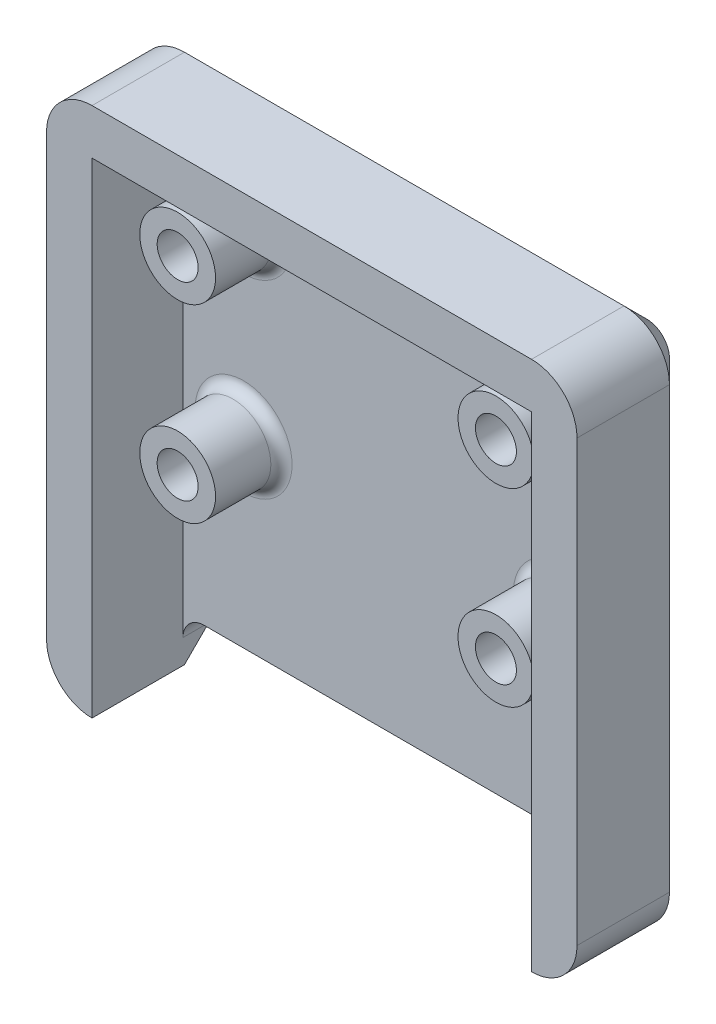
ISO-10303-21;
HEADER;
FILE_DESCRIPTION(('STEP AP214'),'2;1');
FILE_NAME('part.step','',(''),(''),'','','');
FILE_SCHEMA(('AUTOMOTIVE_DESIGN { 1 0 10303 214 1 1 1 1 }'));
ENDSEC;
DATA;
#1=APPLICATION_CONTEXT('core data for automotive mechanical design processes');
#2=APPLICATION_PROTOCOL_DEFINITION('international standard','automotive_design',2000,#1);
#3=PRODUCT_CONTEXT('',#1,'mechanical');
#4=PRODUCT('Part','Part','',(#3));
#5=PRODUCT_RELATED_PRODUCT_CATEGORY('part','',(#4));
#6=PRODUCT_DEFINITION_FORMATION('','',#4);
#7=PRODUCT_DEFINITION_CONTEXT('part definition',#1,'design');
#8=PRODUCT_DEFINITION('design','',#6,#7);
#9=PRODUCT_DEFINITION_SHAPE('','',#8);
#10=(LENGTH_UNIT() NAMED_UNIT(*) SI_UNIT(.MILLI.,.METRE.));
#11=(NAMED_UNIT(*) PLANE_ANGLE_UNIT() SI_UNIT($,.RADIAN.));
#12=(NAMED_UNIT(*) SI_UNIT($,.STERADIAN.) SOLID_ANGLE_UNIT());
#13=UNCERTAINTY_MEASURE_WITH_UNIT(LENGTH_MEASURE(1.E-05),#10,'distance_accuracy_value','');
#14=(GEOMETRIC_REPRESENTATION_CONTEXT(3) GLOBAL_UNCERTAINTY_ASSIGNED_CONTEXT((#13)) GLOBAL_UNIT_ASSIGNED_CONTEXT((#10,
#11,#12)) REPRESENTATION_CONTEXT('',''));
#15=CARTESIAN_POINT('',(0.,0.,0.));
#16=DIRECTION('',(0.,0.,1.));
#17=DIRECTION('',(1.,0.,0.));
#18=AXIS2_PLACEMENT_3D('',#15,#16,#17);
#19=CARTESIAN_POINT('',(0.,0.,0.));
#20=DIRECTION('',(0.,0.,1.));
#21=DIRECTION('',(1.,0.,0.));
#22=AXIS2_PLACEMENT_3D('',#19,#20,#21);
#23=PLANE('',#22);
#24=CARTESIAN_POINT('',(10.5,-2.42,0.));
#25=DIRECTION('',(0.,0.,1.));
#26=DIRECTION('',(1.,0.,0.));
#27=AXIS2_PLACEMENT_3D('',#24,#25,#26);
#28=CIRCLE('',#27,3.2);
#29=CARTESIAN_POINT('',(13.7,-2.42,0.));
#30=VERTEX_POINT('',#29);
#31=EDGE_CURVE('E290',#30,#30,#28,.F.);
#32=ORIENTED_EDGE('',*,*,#31,.T.);
#33=EDGE_LOOP('',(#32));
#34=FACE_BOUND('',#33,.T.);
#35=CARTESIAN_POINT('',(-10.5,-2.42,0.));
#36=DIRECTION('',(0.,0.,1.));
#37=DIRECTION('',(1.,0.,0.));
#38=AXIS2_PLACEMENT_3D('',#35,#36,#37);
#39=CIRCLE('',#38,3.2);
#40=CARTESIAN_POINT('',(-7.3,-2.42,0.));
#41=VERTEX_POINT('',#40);
#42=EDGE_CURVE('E286',#41,#41,#39,.F.);
#43=ORIENTED_EDGE('',*,*,#42,.T.);
#44=EDGE_LOOP('',(#43));
#45=FACE_BOUND('',#44,.T.);
#46=CARTESIAN_POINT('',(10.5,10.08,0.));
#47=DIRECTION('',(0.,0.,1.));
#48=DIRECTION('',(1.,0.,0.));
#49=AXIS2_PLACEMENT_3D('',#46,#47,#48);
#50=CIRCLE('',#49,3.2);
#51=CARTESIAN_POINT('',(13.7,10.08,0.));
#52=VERTEX_POINT('',#51);
#53=EDGE_CURVE('E282',#52,#52,#50,.F.);
#54=ORIENTED_EDGE('',*,*,#53,.T.);
#55=EDGE_LOOP('',(#54));
#56=FACE_BOUND('',#55,.T.);
#57=CARTESIAN_POINT('',(-10.5,10.08,0.));
#58=DIRECTION('',(0.,0.,1.));
#59=DIRECTION('',(1.,0.,0.));
#60=AXIS2_PLACEMENT_3D('',#57,#58,#59);
#61=CIRCLE('',#60,3.2);
#62=CARTESIAN_POINT('',(-7.3,10.08,0.));
#63=VERTEX_POINT('',#62);
#64=EDGE_CURVE('E278',#63,#63,#61,.F.);
#65=ORIENTED_EDGE('',*,*,#64,.T.);
#66=EDGE_LOOP('',(#65));
#67=FACE_BOUND('',#66,.T.);
#68=DIRECTION('',(-1.,0.,0.));
#69=VECTOR('',#68,1.);
#70=CARTESIAN_POINT('',(0.,-14.5,0.));
#71=LINE('',#70,#69);
#72=CARTESIAN_POINT('',(13.1,-14.5,0.));
#73=VERTEX_POINT('',#72);
#74=CARTESIAN_POINT('',(-13.1,-14.5,0.));
#75=VERTEX_POINT('',#74);
#76=EDGE_CURVE('E249',#73,#75,#71,.T.);
#77=ORIENTED_EDGE('',*,*,#76,.F.);
#78=CARTESIAN_POINT('',(13.1,-15.9,0.));
#79=DIRECTION('',(0.,0.,1.));
#80=DIRECTION('',(1.,0.,0.));
#81=AXIS2_PLACEMENT_3D('',#78,#79,#80);
#82=CIRCLE('',#81,1.4);
#83=CARTESIAN_POINT('',(14.5,-15.9,0.));
#84=VERTEX_POINT('',#83);
#85=EDGE_CURVE('E321',#73,#84,#82,.F.);
#86=ORIENTED_EDGE('',*,*,#85,.T.);
#87=DIRECTION('',(0.,1.,0.));
#88=VECTOR('',#87,1.);
#89=CARTESIAN_POINT('',(14.5,0.,0.));
#90=LINE('',#89,#88);
#91=CARTESIAN_POINT('',(14.5,14.5,0.));
#92=VERTEX_POINT('',#91);
#93=EDGE_CURVE('E239',#84,#92,#90,.T.);
#94=ORIENTED_EDGE('',*,*,#93,.T.);
#95=DIRECTION('',(-1.,0.,0.));
#96=VECTOR('',#95,1.);
#97=CARTESIAN_POINT('',(0.,14.5,0.));
#98=LINE('',#97,#96);
#99=CARTESIAN_POINT('',(-14.5,14.5,0.));
#100=VERTEX_POINT('',#99);
#101=EDGE_CURVE('E196',#92,#100,#98,.T.);
#102=ORIENTED_EDGE('',*,*,#101,.T.);
#103=DIRECTION('',(0.,-1.,0.));
#104=VECTOR('',#103,1.);
#105=CARTESIAN_POINT('',(-14.5000000000001,-1.0899845840721E-13,0.));
#106=LINE('',#105,#104);
#107=CARTESIAN_POINT('',(-14.5,-15.9,0.));
#108=VERTEX_POINT('',#107);
#109=EDGE_CURVE('E232',#100,#108,#106,.T.);
#110=ORIENTED_EDGE('',*,*,#109,.T.);
#111=CARTESIAN_POINT('',(-13.1,-15.9,0.));
#112=DIRECTION('',(0.,0.,1.));
#113=DIRECTION('',(1.,0.,0.));
#114=AXIS2_PLACEMENT_3D('',#111,#112,#113);
#115=CIRCLE('',#114,1.4);
#116=EDGE_CURVE('E317',#108,#75,#115,.F.);
#117=ORIENTED_EDGE('',*,*,#116,.T.);
#118=EDGE_LOOP('',(#77,#86,#94,#102,#110,#117));
#119=FACE_BOUND('',#118,.T.);
#120=ADVANCED_FACE('F46',(#34,#45,#56,#67,#119),#23,.T.);
#121=CARTESIAN_POINT('',(-14.5000000000001,-1.0899845840721E-13,-1.6));
#122=DIRECTION('',(-1.,0.,0.));
#123=DIRECTION('',(0.,-1.,0.));
#124=AXIS2_PLACEMENT_3D('',#121,#122,#123);
#125=PLANE('',#124);
#126=DIRECTION('',(0.,0.,1.));
#127=VECTOR('',#126,1.);
#128=CARTESIAN_POINT('',(-14.5,-17.5,-1.6));
#129=LINE('',#128,#127);
#130=CARTESIAN_POINT('',(-14.5,-17.5,-0.0999999999999987));
#131=VERTEX_POINT('',#130);
#132=CARTESIAN_POINT('',(-14.5,-17.5,6.));
#133=VERTEX_POINT('',#132);
#134=EDGE_CURVE('E244',#131,#133,#129,.T.);
#135=ORIENTED_EDGE('',*,*,#134,.F.);
#136=DIRECTION('',(0.,-0.707106781186549,0.707106781186546));
#137=VECTOR('',#136,1.);
#138=CARTESIAN_POINT('',(-14.5,-14.5,-3.09999999999998));
#139=LINE('',#138,#137);
#140=CARTESIAN_POINT('',(-14.5,-16.,-1.6));
#141=VERTEX_POINT('',#140);
#142=EDGE_CURVE('E350',#131,#141,#139,.F.);
#143=ORIENTED_EDGE('',*,*,#142,.T.);
#144=DIRECTION('',(0.,-1.,0.));
#145=VECTOR('',#144,1.);
#146=CARTESIAN_POINT('',(-14.5000000000001,-1.0899845840721E-13,-1.6));
#147=LINE('',#146,#145);
#148=CARTESIAN_POINT('',(-14.5,-15.9,-1.6));
#149=VERTEX_POINT('',#148);
#150=EDGE_CURVE('E250',#149,#141,#147,.T.);
#151=ORIENTED_EDGE('',*,*,#150,.F.);
#152=DIRECTION('',(0.,0.,1.));
#153=VECTOR('',#152,1.);
#154=CARTESIAN_POINT('',(-14.5,-15.9,0.));
#155=LINE('',#154,#153);
#156=EDGE_CURVE('E306',#149,#108,#155,.T.);
#157=ORIENTED_EDGE('',*,*,#156,.T.);
#158=ORIENTED_EDGE('',*,*,#109,.F.);
#159=DIRECTION('',(0.,0.,-1.));
#160=VECTOR('',#159,1.);
#161=CARTESIAN_POINT('',(-14.5,14.5,6.));
#162=LINE('',#161,#160);
#163=CARTESIAN_POINT('',(-14.5,14.5,6.));
#164=VERTEX_POINT('',#163);
#165=EDGE_CURVE('E247',#164,#100,#162,.T.);
#166=ORIENTED_EDGE('',*,*,#165,.F.);
#167=DIRECTION('',(0.,-1.,0.));
#168=VECTOR('',#167,1.);
#169=CARTESIAN_POINT('',(-14.5000000000001,-1.0899845840721E-13,6.));
#170=LINE('',#169,#168);
#171=EDGE_CURVE('E206',#164,#133,#170,.T.);
#172=ORIENTED_EDGE('',*,*,#171,.T.);
#173=EDGE_LOOP('',(#135,#143,#151,#157,#158,#166,#172));
#174=FACE_BOUND('',#173,.T.);
#175=ADVANCED_FACE('F505',(#174),#125,.F.);
#176=CARTESIAN_POINT('',(-14.5,-14.5,-1.6));
#177=DIRECTION('',(0.,0.,1.));
#178=DIRECTION('',(1.,0.,0.));
#179=AXIS2_PLACEMENT_3D('',#176,#177,#178);
#180=CYLINDRICAL_SURFACE('',#179,3.);
#181=DIRECTION('',(0.,0.,1.));
#182=VECTOR('',#181,1.);
#183=CARTESIAN_POINT('',(-17.5,-14.5,-1.6));
#184=LINE('',#183,#182);
#185=CARTESIAN_POINT('',(-17.5,-14.5,-0.0999999999999987));
#186=VERTEX_POINT('',#185);
#187=CARTESIAN_POINT('',(-17.5,-14.5,6.));
#188=VERTEX_POINT('',#187);
#189=EDGE_CURVE('E184',#186,#188,#184,.T.);
#190=ORIENTED_EDGE('',*,*,#189,.F.);
#191=CARTESIAN_POINT('',(-14.5,-14.5,-0.0999999999999987));
#192=DIRECTION('',(0.,0.,1.));
#193=DIRECTION('',(1.,0.,0.));
#194=AXIS2_PLACEMENT_3D('',#191,#192,#193);
#195=CIRCLE('',#194,3.);
#196=EDGE_CURVE('E348',#186,#131,#195,.T.);
#197=ORIENTED_EDGE('',*,*,#196,.T.);
#198=ORIENTED_EDGE('',*,*,#134,.T.);
#199=CARTESIAN_POINT('',(-14.5,-14.5,6.));
#200=DIRECTION('',(0.,0.,1.));
#201=DIRECTION('',(1.,0.,0.));
#202=AXIS2_PLACEMENT_3D('',#199,#200,#201);
#203=CIRCLE('',#202,3.);
#204=EDGE_CURVE('E202',#188,#133,#203,.T.);
#205=ORIENTED_EDGE('',*,*,#204,.F.);
#206=EDGE_LOOP('',(#190,#197,#198,#205));
#207=FACE_BOUND('',#206,.T.);
#208=ADVANCED_FACE('F533',(#207),#180,.T.);
#209=CARTESIAN_POINT('',(-17.5,0.,-1.6));
#210=DIRECTION('',(1.,0.,0.));
#211=DIRECTION('',(0.,0.,-1.));
#212=AXIS2_PLACEMENT_3D('',#209,#210,#211);
#213=PLANE('',#212);
#214=DIRECTION('',(0.,0.,1.));
#215=VECTOR('',#214,1.);
#216=CARTESIAN_POINT('',(-17.5,14.5,-1.6));
#217=LINE('',#216,#215);
#218=CARTESIAN_POINT('',(-17.5,14.5,-0.0999999999999987));
#219=VERTEX_POINT('',#218);
#220=CARTESIAN_POINT('',(-17.5,14.5,6.));
#221=VERTEX_POINT('',#220);
#222=EDGE_CURVE('E176',#219,#221,#217,.T.);
#223=ORIENTED_EDGE('',*,*,#222,.F.);
#224=DIRECTION('',(0.,-1.,0.));
#225=VECTOR('',#224,1.);
#226=CARTESIAN_POINT('',(-17.5,0.,-0.0999999999999987));
#227=LINE('',#226,#225);
#228=EDGE_CURVE('E355',#219,#186,#227,.T.);
#229=ORIENTED_EDGE('',*,*,#228,.T.);
#230=ORIENTED_EDGE('',*,*,#189,.T.);
#231=DIRECTION('',(0.,1.,0.));
#232=VECTOR('',#231,1.);
#233=CARTESIAN_POINT('',(-17.5,0.,6.));
#234=LINE('',#233,#232);
#235=EDGE_CURVE('E192',#188,#221,#234,.T.);
#236=ORIENTED_EDGE('',*,*,#235,.T.);
#237=EDGE_LOOP('',(#223,#229,#230,#236));
#238=FACE_BOUND('',#237,.T.);
#239=ADVANCED_FACE('F198',(#238),#213,.F.);
#240=CARTESIAN_POINT('',(-14.5,14.5,-1.6));
#241=DIRECTION('',(0.,0.,1.));
#242=DIRECTION('',(1.,0.,0.));
#243=AXIS2_PLACEMENT_3D('',#240,#241,#242);
#244=CYLINDRICAL_SURFACE('',#243,3.);
#245=DIRECTION('',(0.,0.,1.));
#246=VECTOR('',#245,1.);
#247=CARTESIAN_POINT('',(-14.5,17.5,-1.6));
#248=LINE('',#247,#246);
#249=CARTESIAN_POINT('',(-14.5,17.5,-0.0999999999999987));
#250=VERTEX_POINT('',#249);
#251=CARTESIAN_POINT('',(-14.5,17.5,6.));
#252=VERTEX_POINT('',#251);
#253=EDGE_CURVE('E185',#250,#252,#248,.T.);
#254=ORIENTED_EDGE('',*,*,#253,.F.);
#255=CARTESIAN_POINT('',(-14.5,14.5,-0.0999999999999987));
#256=DIRECTION('',(0.,0.,1.));
#257=DIRECTION('',(1.,0.,0.));
#258=AXIS2_PLACEMENT_3D('',#255,#256,#257);
#259=CIRCLE('',#258,3.);
#260=EDGE_CURVE('E57',#250,#219,#259,.T.);
#261=ORIENTED_EDGE('',*,*,#260,.T.);
#262=ORIENTED_EDGE('',*,*,#222,.T.);
#263=CARTESIAN_POINT('',(-14.5,14.5,6.));
#264=DIRECTION('',(0.,0.,1.));
#265=DIRECTION('',(1.,0.,0.));
#266=AXIS2_PLACEMENT_3D('',#263,#264,#265);
#267=CIRCLE('',#266,3.);
#268=EDGE_CURVE('E179',#221,#252,#267,.F.);
#269=ORIENTED_EDGE('',*,*,#268,.T.);
#270=EDGE_LOOP('',(#254,#261,#262,#269));
#271=FACE_BOUND('',#270,.T.);
#272=ADVANCED_FACE('F178',(#271),#244,.T.);
#273=CARTESIAN_POINT('',(0.,17.5,-1.6));
#274=DIRECTION('',(0.,1.,0.));
#275=DIRECTION('',(0.,0.,1.));
#276=AXIS2_PLACEMENT_3D('',#273,#274,#275);
#277=PLANE('',#276);
#278=DIRECTION('',(0.,0.,1.));
#279=VECTOR('',#278,1.);
#280=CARTESIAN_POINT('',(14.5,17.5,-1.6));
#281=LINE('',#280,#279);
#282=CARTESIAN_POINT('',(14.5,17.5,-0.0999999999999987));
#283=VERTEX_POINT('',#282);
#284=CARTESIAN_POINT('',(14.5,17.5,6.));
#285=VERTEX_POINT('',#284);
#286=EDGE_CURVE('E267',#283,#285,#281,.T.);
#287=ORIENTED_EDGE('',*,*,#286,.F.);
#288=DIRECTION('',(-1.,0.,0.));
#289=VECTOR('',#288,1.);
#290=CARTESIAN_POINT('',(-14.5,17.5,-0.0999999999999987));
#291=LINE('',#290,#289);
#292=EDGE_CURVE('E12',#283,#250,#291,.T.);
#293=ORIENTED_EDGE('',*,*,#292,.T.);
#294=ORIENTED_EDGE('',*,*,#253,.T.);
#295=DIRECTION('',(-1.,0.,0.));
#296=VECTOR('',#295,1.);
#297=CARTESIAN_POINT('',(0.,17.5,6.));
#298=LINE('',#297,#296);
#299=EDGE_CURVE('E195',#285,#252,#298,.T.);
#300=ORIENTED_EDGE('',*,*,#299,.F.);
#301=EDGE_LOOP('',(#287,#293,#294,#300));
#302=FACE_BOUND('',#301,.T.);
#303=ADVANCED_FACE('F545',(#302),#277,.T.);
#304=CARTESIAN_POINT('',(14.5,14.5,-1.6));
#305=DIRECTION('',(0.,0.,1.));
#306=DIRECTION('',(1.,0.,0.));
#307=AXIS2_PLACEMENT_3D('',#304,#305,#306);
#308=CYLINDRICAL_SURFACE('',#307,3.);
#309=DIRECTION('',(0.,0.,1.));
#310=VECTOR('',#309,1.);
#311=CARTESIAN_POINT('',(17.5,14.5,-1.6));
#312=LINE('',#311,#310);
#313=CARTESIAN_POINT('',(17.5,14.5,-0.0999999999999987));
#314=VERTEX_POINT('',#313);
#315=CARTESIAN_POINT('',(17.5,14.5,6.));
#316=VERTEX_POINT('',#315);
#317=EDGE_CURVE('E270',#314,#316,#312,.T.);
#318=ORIENTED_EDGE('',*,*,#317,.F.);
#319=CARTESIAN_POINT('',(14.5,14.5,-0.0999999999999987));
#320=DIRECTION('',(0.,0.,1.));
#321=DIRECTION('',(1.,0.,0.));
#322=AXIS2_PLACEMENT_3D('',#319,#320,#321);
#323=CIRCLE('',#322,3.);
#324=EDGE_CURVE('E73',#314,#283,#323,.T.);
#325=ORIENTED_EDGE('',*,*,#324,.T.);
#326=ORIENTED_EDGE('',*,*,#286,.T.);
#327=CARTESIAN_POINT('',(14.5,14.5,6.));
#328=DIRECTION('',(0.,0.,1.));
#329=DIRECTION('',(1.,0.,0.));
#330=AXIS2_PLACEMENT_3D('',#327,#328,#329);
#331=CIRCLE('',#330,3.);
#332=EDGE_CURVE('E227',#285,#316,#331,.F.);
#333=ORIENTED_EDGE('',*,*,#332,.T.);
#334=EDGE_LOOP('',(#318,#325,#326,#333));
#335=FACE_BOUND('',#334,.T.);
#336=ADVANCED_FACE('F548',(#335),#308,.T.);
#337=CARTESIAN_POINT('',(17.5,0.,-1.6));
#338=DIRECTION('',(1.,0.,0.));
#339=DIRECTION('',(0.,0.,-1.));
#340=AXIS2_PLACEMENT_3D('',#337,#338,#339);
#341=PLANE('',#340);
#342=DIRECTION('',(0.,0.,1.));
#343=VECTOR('',#342,1.);
#344=CARTESIAN_POINT('',(17.5,-14.5,-1.6));
#345=LINE('',#344,#343);
#346=CARTESIAN_POINT('',(17.5,-14.5,-0.0999999999999987));
#347=VERTEX_POINT('',#346);
#348=CARTESIAN_POINT('',(17.5,-14.5,6.));
#349=VERTEX_POINT('',#348);
#350=EDGE_CURVE('E272',#347,#349,#345,.T.);
#351=ORIENTED_EDGE('',*,*,#350,.F.);
#352=DIRECTION('',(0.,1.,0.));
#353=VECTOR('',#352,1.);
#354=CARTESIAN_POINT('',(17.5,14.5,-0.0999999999999987));
#355=LINE('',#354,#353);
#356=EDGE_CURVE('E352',#347,#314,#355,.T.);
#357=ORIENTED_EDGE('',*,*,#356,.T.);
#358=ORIENTED_EDGE('',*,*,#317,.T.);
#359=DIRECTION('',(0.,1.,0.));
#360=VECTOR('',#359,1.);
#361=CARTESIAN_POINT('',(17.5,0.,6.));
#362=LINE('',#361,#360);
#363=EDGE_CURVE('E223',#349,#316,#362,.T.);
#364=ORIENTED_EDGE('',*,*,#363,.F.);
#365=EDGE_LOOP('',(#351,#357,#358,#364));
#366=FACE_BOUND('',#365,.T.);
#367=ADVANCED_FACE('F551',(#366),#341,.T.);
#368=CARTESIAN_POINT('',(14.5,-14.5,-1.6));
#369=DIRECTION('',(0.,0.,1.));
#370=DIRECTION('',(1.,0.,0.));
#371=AXIS2_PLACEMENT_3D('',#368,#369,#370);
#372=CYLINDRICAL_SURFACE('',#371,3.);
#373=DIRECTION('',(0.,0.,1.));
#374=VECTOR('',#373,1.);
#375=CARTESIAN_POINT('',(14.5,-17.5,-1.6));
#376=LINE('',#375,#374);
#377=CARTESIAN_POINT('',(14.5,-17.5,-0.0999999999999987));
#378=VERTEX_POINT('',#377);
#379=CARTESIAN_POINT('',(14.5,-17.5,6.));
#380=VERTEX_POINT('',#379);
#381=EDGE_CURVE('E259',#378,#380,#376,.T.);
#382=ORIENTED_EDGE('',*,*,#381,.F.);
#383=CARTESIAN_POINT('',(14.5,-14.5,-0.0999999999999987));
#384=DIRECTION('',(0.,0.,1.));
#385=DIRECTION('',(1.,0.,0.));
#386=AXIS2_PLACEMENT_3D('',#383,#384,#385);
#387=CIRCLE('',#386,3.);
#388=EDGE_CURVE('E346',#378,#347,#387,.T.);
#389=ORIENTED_EDGE('',*,*,#388,.T.);
#390=ORIENTED_EDGE('',*,*,#350,.T.);
#391=CARTESIAN_POINT('',(14.5,-14.5,6.));
#392=DIRECTION('',(0.,0.,1.));
#393=DIRECTION('',(1.,0.,0.));
#394=AXIS2_PLACEMENT_3D('',#391,#392,#393);
#395=CIRCLE('',#394,3.);
#396=EDGE_CURVE('E220',#349,#380,#395,.F.);
#397=ORIENTED_EDGE('',*,*,#396,.T.);
#398=EDGE_LOOP('',(#382,#389,#390,#397));
#399=FACE_BOUND('',#398,.T.);
#400=ADVANCED_FACE('F477',(#399),#372,.T.);
#401=CARTESIAN_POINT('',(14.5,0.,-1.6));
#402=DIRECTION('',(1.,0.,0.));
#403=DIRECTION('',(0.,1.,0.));
#404=AXIS2_PLACEMENT_3D('',#401,#402,#403);
#405=PLANE('',#404);
#406=DIRECTION('',(0.,1.,0.));
#407=VECTOR('',#406,1.);
#408=CARTESIAN_POINT('',(14.5,0.,-1.6));
#409=LINE('',#408,#407);
#410=CARTESIAN_POINT('',(14.5,-16.,-1.6));
#411=VERTEX_POINT('',#410);
#412=CARTESIAN_POINT('',(14.5,-15.9,-1.6));
#413=VERTEX_POINT('',#412);
#414=EDGE_CURVE('E257',#411,#413,#409,.T.);
#415=ORIENTED_EDGE('',*,*,#414,.F.);
#416=DIRECTION('',(0.,0.707106781186549,-0.707106781186546));
#417=VECTOR('',#416,1.);
#418=CARTESIAN_POINT('',(14.5,-14.5,-3.09999999999998));
#419=LINE('',#418,#417);
#420=EDGE_CURVE('E344',#411,#378,#419,.F.);
#421=ORIENTED_EDGE('',*,*,#420,.T.);
#422=ORIENTED_EDGE('',*,*,#381,.T.);
#423=DIRECTION('',(0.,1.,0.));
#424=VECTOR('',#423,1.);
#425=CARTESIAN_POINT('',(14.5,0.,6.));
#426=LINE('',#425,#424);
#427=CARTESIAN_POINT('',(14.5,14.5,6.));
#428=VERTEX_POINT('',#427);
#429=EDGE_CURVE('E216',#380,#428,#426,.T.);
#430=ORIENTED_EDGE('',*,*,#429,.T.);
#431=DIRECTION('',(0.,0.,-1.));
#432=VECTOR('',#431,1.);
#433=CARTESIAN_POINT('',(14.5,14.5,6.));
#434=LINE('',#433,#432);
#435=EDGE_CURVE('E231',#428,#92,#434,.T.);
#436=ORIENTED_EDGE('',*,*,#435,.T.);
#437=ORIENTED_EDGE('',*,*,#93,.F.);
#438=DIRECTION('',(0.,0.,1.));
#439=VECTOR('',#438,1.);
#440=CARTESIAN_POINT('',(14.5,-15.9,-1.6));
#441=LINE('',#440,#439);
#442=EDGE_CURVE('E314',#84,#413,#441,.F.);
#443=ORIENTED_EDGE('',*,*,#442,.T.);
#444=EDGE_LOOP('',(#415,#421,#422,#430,#436,#437,#443));
#445=FACE_BOUND('',#444,.T.);
#446=ADVANCED_FACE('F474',(#445),#405,.F.);
#447=CARTESIAN_POINT('',(0.,-14.5,-1.6));
#448=DIRECTION('',(0.,1.,0.));
#449=DIRECTION('',(0.,0.,1.));
#450=AXIS2_PLACEMENT_3D('',#447,#448,#449);
#451=PLANE('',#450);
#452=ORIENTED_EDGE('',*,*,#76,.T.);
#453=DIRECTION('',(0.,0.,1.));
#454=VECTOR('',#453,1.);
#455=CARTESIAN_POINT('',(-13.1,-14.5,-1.6));
#456=LINE('',#455,#454);
#457=CARTESIAN_POINT('',(-13.1,-14.5,-1.6));
#458=VERTEX_POINT('',#457);
#459=EDGE_CURVE('E312',#75,#458,#456,.F.);
#460=ORIENTED_EDGE('',*,*,#459,.T.);
#461=DIRECTION('',(-1.,0.,0.));
#462=VECTOR('',#461,1.);
#463=CARTESIAN_POINT('',(0.,-14.5,-1.6));
#464=LINE('',#463,#462);
#465=CARTESIAN_POINT('',(13.1,-14.5,-1.6));
#466=VERTEX_POINT('',#465);
#467=EDGE_CURVE('E253',#466,#458,#464,.T.);
#468=ORIENTED_EDGE('',*,*,#467,.F.);
#469=DIRECTION('',(0.,0.,1.));
#470=VECTOR('',#469,1.);
#471=CARTESIAN_POINT('',(13.1,-14.5,0.));
#472=LINE('',#471,#470);
#473=EDGE_CURVE('E309',#466,#73,#472,.T.);
#474=ORIENTED_EDGE('',*,*,#473,.T.);
#475=EDGE_LOOP('',(#452,#460,#468,#474));
#476=FACE_BOUND('',#475,.T.);
#477=ADVANCED_FACE('F457',(#476),#451,.F.);
#478=CARTESIAN_POINT('',(0.,0.,-1.6));
#479=DIRECTION('',(0.,0.,1.));
#480=DIRECTION('',(1.,0.,0.));
#481=AXIS2_PLACEMENT_3D('',#478,#479,#480);
#482=PLANE('',#481);
#483=CARTESIAN_POINT('',(-10.5,10.08,-1.6));
#484=DIRECTION('',(0.,0.,-1.));
#485=DIRECTION('',(-1.,0.,0.));
#486=AXIS2_PLACEMENT_3D('',#483,#484,#485);
#487=CIRCLE('',#486,2.1844);
#488=CARTESIAN_POINT('',(-12.6844,10.08,-1.6));
#489=VERTEX_POINT('',#488);
#490=EDGE_CURVE('E413',#489,#489,#487,.T.);
#491=ORIENTED_EDGE('',*,*,#490,.F.);
#492=EDGE_LOOP('',(#491));
#493=FACE_BOUND('',#492,.T.);
#494=CARTESIAN_POINT('',(-10.5,-2.42,-1.6));
#495=DIRECTION('',(0.,0.,-1.));
#496=DIRECTION('',(-1.,0.,0.));
#497=AXIS2_PLACEMENT_3D('',#494,#495,#496);
#498=CIRCLE('',#497,2.1844);
#499=CARTESIAN_POINT('',(-12.6844,-2.42,-1.6));
#500=VERTEX_POINT('',#499);
#501=EDGE_CURVE('E422',#500,#500,#498,.T.);
#502=ORIENTED_EDGE('',*,*,#501,.F.);
#503=EDGE_LOOP('',(#502));
#504=FACE_BOUND('',#503,.T.);
#505=CARTESIAN_POINT('',(10.5,10.08,-1.6));
#506=DIRECTION('',(0.,0.,-1.));
#507=DIRECTION('',(-1.,0.,0.));
#508=AXIS2_PLACEMENT_3D('',#505,#506,#507);
#509=CIRCLE('',#508,2.1844);
#510=CARTESIAN_POINT('',(8.3156,10.08,-1.6));
#511=VERTEX_POINT('',#510);
#512=EDGE_CURVE('E430',#511,#511,#509,.T.);
#513=ORIENTED_EDGE('',*,*,#512,.F.);
#514=EDGE_LOOP('',(#513));
#515=FACE_BOUND('',#514,.T.);
#516=CARTESIAN_POINT('',(10.5,-2.42,-1.6));
#517=DIRECTION('',(0.,0.,-1.));
#518=DIRECTION('',(-1.,0.,0.));
#519=AXIS2_PLACEMENT_3D('',#516,#517,#518);
#520=CIRCLE('',#519,2.1844);
#521=CARTESIAN_POINT('',(8.31560000000001,-2.42,-1.6));
#522=VERTEX_POINT('',#521);
#523=EDGE_CURVE('E436',#522,#522,#520,.T.);
#524=ORIENTED_EDGE('',*,*,#523,.F.);
#525=EDGE_LOOP('',(#524));
#526=FACE_BOUND('',#525,.T.);
#527=DIRECTION('',(0.,-1.,0.));
#528=VECTOR('',#527,1.);
#529=CARTESIAN_POINT('',(16.,-14.5,-1.6));
#530=LINE('',#529,#528);
#531=CARTESIAN_POINT('',(16.,14.5,-1.6));
#532=VERTEX_POINT('',#531);
#533=CARTESIAN_POINT('',(16.,-14.5,-1.6));
#534=VERTEX_POINT('',#533);
#535=EDGE_CURVE('E336',#532,#534,#530,.T.);
#536=ORIENTED_EDGE('',*,*,#535,.T.);
#537=CARTESIAN_POINT('',(14.5,-14.5,-1.6));
#538=DIRECTION('',(0.,0.,1.));
#539=DIRECTION('',(1.,0.,0.));
#540=AXIS2_PLACEMENT_3D('',#537,#538,#539);
#541=CIRCLE('',#540,1.49999999999999);
#542=EDGE_CURVE('E341',#534,#411,#541,.F.);
#543=ORIENTED_EDGE('',*,*,#542,.T.);
#544=ORIENTED_EDGE('',*,*,#414,.T.);
#545=CARTESIAN_POINT('',(13.1,-15.9,-1.6));
#546=DIRECTION('',(0.,0.,1.));
#547=DIRECTION('',(1.,0.,0.));
#548=AXIS2_PLACEMENT_3D('',#545,#546,#547);
#549=CIRCLE('',#548,1.4);
#550=EDGE_CURVE('E324',#413,#466,#549,.T.);
#551=ORIENTED_EDGE('',*,*,#550,.T.);
#552=ORIENTED_EDGE('',*,*,#467,.T.);
#553=CARTESIAN_POINT('',(-13.1,-15.9,-1.6));
#554=DIRECTION('',(0.,0.,1.));
#555=DIRECTION('',(1.,0.,0.));
#556=AXIS2_PLACEMENT_3D('',#553,#554,#555);
#557=CIRCLE('',#556,1.4);
#558=EDGE_CURVE('E319',#458,#149,#557,.T.);
#559=ORIENTED_EDGE('',*,*,#558,.T.);
#560=ORIENTED_EDGE('',*,*,#150,.T.);
#561=CARTESIAN_POINT('',(-14.5,-14.5,-1.6));
#562=DIRECTION('',(0.,0.,1.));
#563=DIRECTION('',(1.,0.,0.));
#564=AXIS2_PLACEMENT_3D('',#561,#562,#563);
#565=CIRCLE('',#564,1.49999999999999);
#566=CARTESIAN_POINT('',(-16.,-14.5,-1.6));
#567=VERTEX_POINT('',#566);
#568=EDGE_CURVE('E339',#141,#567,#565,.F.);
#569=ORIENTED_EDGE('',*,*,#568,.T.);
#570=DIRECTION('',(0.,1.,0.));
#571=VECTOR('',#570,1.);
#572=CARTESIAN_POINT('',(-16.,0.,-1.6));
#573=LINE('',#572,#571);
#574=CARTESIAN_POINT('',(-16.,14.5,-1.6));
#575=VERTEX_POINT('',#574);
#576=EDGE_CURVE('E334',#567,#575,#573,.T.);
#577=ORIENTED_EDGE('',*,*,#576,.T.);
#578=CARTESIAN_POINT('',(-14.5,14.5,-1.6));
#579=DIRECTION('',(0.,0.,1.));
#580=DIRECTION('',(1.,0.,0.));
#581=AXIS2_PLACEMENT_3D('',#578,#579,#580);
#582=CIRCLE('',#581,1.49999999999999);
#583=CARTESIAN_POINT('',(-14.5,16.,-1.6));
#584=VERTEX_POINT('',#583);
#585=EDGE_CURVE('E329',#575,#584,#582,.F.);
#586=ORIENTED_EDGE('',*,*,#585,.T.);
#587=DIRECTION('',(1.,0.,0.));
#588=VECTOR('',#587,1.);
#589=CARTESIAN_POINT('',(14.5,16.,-1.6));
#590=LINE('',#589,#588);
#591=CARTESIAN_POINT('',(14.5,16.,-1.6));
#592=VERTEX_POINT('',#591);
#593=EDGE_CURVE('E326',#584,#592,#590,.T.);
#594=ORIENTED_EDGE('',*,*,#593,.T.);
#595=CARTESIAN_POINT('',(14.5,14.5,-1.6));
#596=DIRECTION('',(0.,0.,1.));
#597=DIRECTION('',(1.,0.,0.));
#598=AXIS2_PLACEMENT_3D('',#595,#596,#597);
#599=CIRCLE('',#598,1.49999999999999);
#600=EDGE_CURVE('E331',#592,#532,#599,.F.);
#601=ORIENTED_EDGE('',*,*,#600,.T.);
#602=EDGE_LOOP('',(#536,#543,#544,#551,#552,#559,#560,#569,#577,#586,#594,#601));
#603=FACE_BOUND('',#602,.T.);
#604=ADVANCED_FACE('F453',(#493,#504,#515,#526,#603),#482,.F.);
#605=CARTESIAN_POINT('',(0.,14.5,6.));
#606=DIRECTION('',(0.,-1.,0.));
#607=DIRECTION('',(0.,0.,-1.));
#608=AXIS2_PLACEMENT_3D('',#605,#606,#607);
#609=PLANE('',#608);
#610=ORIENTED_EDGE('',*,*,#101,.F.);
#611=ORIENTED_EDGE('',*,*,#435,.F.);
#612=DIRECTION('',(-1.,0.,0.));
#613=VECTOR('',#612,1.);
#614=CARTESIAN_POINT('',(0.,14.5,6.));
#615=LINE('',#614,#613);
#616=EDGE_CURVE('E213',#428,#164,#615,.T.);
#617=ORIENTED_EDGE('',*,*,#616,.T.);
#618=ORIENTED_EDGE('',*,*,#165,.T.);
#619=EDGE_LOOP('',(#610,#611,#617,#618));
#620=FACE_BOUND('',#619,.T.);
#621=ADVANCED_FACE('F456',(#620),#609,.T.);
#622=CARTESIAN_POINT('',(0.,0.,6.));
#623=DIRECTION('',(0.,0.,1.));
#624=DIRECTION('',(1.,0.,0.));
#625=AXIS2_PLACEMENT_3D('',#622,#623,#624);
#626=PLANE('',#625);
#627=ORIENTED_EDGE('',*,*,#268,.F.);
#628=ORIENTED_EDGE('',*,*,#235,.F.);
#629=ORIENTED_EDGE('',*,*,#204,.T.);
#630=ORIENTED_EDGE('',*,*,#171,.F.);
#631=ORIENTED_EDGE('',*,*,#616,.F.);
#632=ORIENTED_EDGE('',*,*,#429,.F.);
#633=ORIENTED_EDGE('',*,*,#396,.F.);
#634=ORIENTED_EDGE('',*,*,#363,.T.);
#635=ORIENTED_EDGE('',*,*,#332,.F.);
#636=ORIENTED_EDGE('',*,*,#299,.T.);
#637=EDGE_LOOP('',(#627,#628,#629,#630,#631,#632,#633,#634,#635,#636));
#638=FACE_BOUND('',#637,.T.);
#639=ADVANCED_FACE('F190',(#638),#626,.T.);
#640=CARTESIAN_POINT('',(10.5,-2.42,-1.6));
#641=DIRECTION('',(0.,0.,-1.));
#642=DIRECTION('',(-1.,0.,0.));
#643=AXIS2_PLACEMENT_3D('',#640,#641,#642);
#644=CYLINDRICAL_SURFACE('',#643,1.35255);
#645=CARTESIAN_POINT('',(10.5,-2.42,-0.901994971805179));
#646=DIRECTION('',(0.,0.,-1.));
#647=DIRECTION('',(-1.,0.,0.));
#648=AXIS2_PLACEMENT_3D('',#645,#646,#647);
#649=CIRCLE('',#648,1.35255);
#650=CARTESIAN_POINT('',(9.14745000000001,-2.42,-0.901994971805179));
#651=VERTEX_POINT('',#650);
#652=EDGE_CURVE('E235',#651,#651,#649,.T.);
#653=ORIENTED_EDGE('',*,*,#652,.T.);
#654=EDGE_LOOP('',(#653));
#655=FACE_BOUND('',#654,.T.);
#656=CARTESIAN_POINT('',(10.5,-2.42,4.35));
#657=DIRECTION('',(0.,0.,1.));
#658=DIRECTION('',(1.,0.,0.));
#659=AXIS2_PLACEMENT_3D('',#656,#657,#658);
#660=CIRCLE('',#659,1.35255);
#661=CARTESIAN_POINT('',(11.85255,-2.42,4.35));
#662=VERTEX_POINT('',#661);
#663=EDGE_CURVE('E393',#662,#662,#660,.T.);
#664=ORIENTED_EDGE('',*,*,#663,.T.);
#665=EDGE_LOOP('',(#664));
#666=FACE_BOUND('',#665,.T.);
#667=ADVANCED_FACE('F443',(#655,#666),#644,.F.);
#668=CARTESIAN_POINT('',(10.5,-2.42,-1.6));
#669=DIRECTION('',(0.,0.,-1.));
#670=DIRECTION('',(-1.,0.,0.));
#671=AXIS2_PLACEMENT_3D('',#668,#669,#670);
#672=CONICAL_SURFACE('',#671,2.1844,0.872664625997164);
#673=ORIENTED_EDGE('',*,*,#652,.F.);
#674=EDGE_LOOP('',(#673));
#675=FACE_BOUND('',#674,.T.);
#676=ORIENTED_EDGE('',*,*,#523,.T.);
#677=EDGE_LOOP('',(#676));
#678=FACE_BOUND('',#677,.T.);
#679=ADVANCED_FACE('F446',(#675,#678),#672,.F.);
#680=CARTESIAN_POINT('',(10.5,10.08,-1.6));
#681=DIRECTION('',(0.,0.,-1.));
#682=DIRECTION('',(-1.,0.,0.));
#683=AXIS2_PLACEMENT_3D('',#680,#681,#682);
#684=CYLINDRICAL_SURFACE('',#683,1.35255);
#685=CARTESIAN_POINT('',(10.5,10.08,-0.901994971805179));
#686=DIRECTION('',(0.,0.,-1.));
#687=DIRECTION('',(-1.,0.,0.));
#688=AXIS2_PLACEMENT_3D('',#685,#686,#687);
#689=CIRCLE('',#688,1.35255);
#690=CARTESIAN_POINT('',(9.14745,10.08,-0.901994971805179));
#691=VERTEX_POINT('',#690);
#692=EDGE_CURVE('E433',#691,#691,#689,.T.);
#693=ORIENTED_EDGE('',*,*,#692,.T.);
#694=EDGE_LOOP('',(#693));
#695=FACE_BOUND('',#694,.T.);
#696=CARTESIAN_POINT('',(10.5,10.08,4.35));
#697=DIRECTION('',(0.,0.,1.));
#698=DIRECTION('',(1.,0.,0.));
#699=AXIS2_PLACEMENT_3D('',#696,#697,#698);
#700=CIRCLE('',#699,1.35255);
#701=CARTESIAN_POINT('',(11.85255,10.08,4.35));
#702=VERTEX_POINT('',#701);
#703=EDGE_CURVE('E400',#702,#702,#700,.T.);
#704=ORIENTED_EDGE('',*,*,#703,.T.);
#705=EDGE_LOOP('',(#704));
#706=FACE_BOUND('',#705,.T.);
#707=ADVANCED_FACE('F449',(#695,#706),#684,.F.);
#708=CARTESIAN_POINT('',(10.5,10.08,-1.6));
#709=DIRECTION('',(0.,0.,-1.));
#710=DIRECTION('',(-1.,0.,0.));
#711=AXIS2_PLACEMENT_3D('',#708,#709,#710);
#712=CONICAL_SURFACE('',#711,2.1844,0.872664625997164);
#713=ORIENTED_EDGE('',*,*,#692,.F.);
#714=EDGE_LOOP('',(#713));
#715=FACE_BOUND('',#714,.T.);
#716=ORIENTED_EDGE('',*,*,#512,.T.);
#717=EDGE_LOOP('',(#716));
#718=FACE_BOUND('',#717,.T.);
#719=ADVANCED_FACE('F736',(#715,#718),#712,.F.);
#720=CARTESIAN_POINT('',(-10.5,-2.42,-1.6));
#721=DIRECTION('',(0.,0.,-1.));
#722=DIRECTION('',(-1.,0.,0.));
#723=AXIS2_PLACEMENT_3D('',#720,#721,#722);
#724=CYLINDRICAL_SURFACE('',#723,1.35255);
#725=CARTESIAN_POINT('',(-10.5,-2.42,-0.901994971805179));
#726=DIRECTION('',(0.,0.,-1.));
#727=DIRECTION('',(-1.,0.,0.));
#728=AXIS2_PLACEMENT_3D('',#725,#726,#727);
#729=CIRCLE('',#728,1.35255);
#730=CARTESIAN_POINT('',(-11.85255,-2.42,-0.901994971805179));
#731=VERTEX_POINT('',#730);
#732=EDGE_CURVE('E426',#731,#731,#729,.T.);
#733=ORIENTED_EDGE('',*,*,#732,.T.);
#734=EDGE_LOOP('',(#733));
#735=FACE_BOUND('',#734,.T.);
#736=CARTESIAN_POINT('',(-10.5,-2.42,4.35));
#737=DIRECTION('',(0.,0.,1.));
#738=DIRECTION('',(1.,0.,0.));
#739=AXIS2_PLACEMENT_3D('',#736,#737,#738);
#740=CIRCLE('',#739,1.35255);
#741=CARTESIAN_POINT('',(-9.14745,-2.42,4.35));
#742=VERTEX_POINT('',#741);
#743=EDGE_CURVE('E379',#742,#742,#740,.T.);
#744=ORIENTED_EDGE('',*,*,#743,.T.);
#745=EDGE_LOOP('',(#744));
#746=FACE_BOUND('',#745,.T.);
#747=ADVANCED_FACE('F728',(#735,#746),#724,.F.);
#748=CARTESIAN_POINT('',(-10.5,-2.42,-1.6));
#749=DIRECTION('',(0.,0.,-1.));
#750=DIRECTION('',(-1.,0.,0.));
#751=AXIS2_PLACEMENT_3D('',#748,#749,#750);
#752=CONICAL_SURFACE('',#751,2.1844,0.872664625997164);
#753=ORIENTED_EDGE('',*,*,#732,.F.);
#754=EDGE_LOOP('',(#753));
#755=FACE_BOUND('',#754,.T.);
#756=ORIENTED_EDGE('',*,*,#501,.T.);
#757=EDGE_LOOP('',(#756));
#758=FACE_BOUND('',#757,.T.);
#759=ADVANCED_FACE('F720',(#755,#758),#752,.F.);
#760=CARTESIAN_POINT('',(-10.5,10.08,-1.6));
#761=DIRECTION('',(0.,0.,-1.));
#762=DIRECTION('',(-1.,0.,0.));
#763=AXIS2_PLACEMENT_3D('',#760,#761,#762);
#764=CYLINDRICAL_SURFACE('',#763,1.35255);
#765=CARTESIAN_POINT('',(-10.5,10.08,-0.901994971805179));
#766=DIRECTION('',(0.,0.,-1.));
#767=DIRECTION('',(-1.,0.,0.));
#768=AXIS2_PLACEMENT_3D('',#765,#766,#767);
#769=CIRCLE('',#768,1.35255);
#770=CARTESIAN_POINT('',(-11.85255,10.08,-0.901994971805179));
#771=VERTEX_POINT('',#770);
#772=EDGE_CURVE('E419',#771,#771,#769,.T.);
#773=ORIENTED_EDGE('',*,*,#772,.T.);
#774=EDGE_LOOP('',(#773));
#775=FACE_BOUND('',#774,.T.);
#776=CARTESIAN_POINT('',(-10.5,10.08,4.35));
#777=DIRECTION('',(0.,0.,1.));
#778=DIRECTION('',(1.,0.,0.));
#779=AXIS2_PLACEMENT_3D('',#776,#777,#778);
#780=CIRCLE('',#779,1.35255);
#781=CARTESIAN_POINT('',(-9.14745,10.08,4.35));
#782=VERTEX_POINT('',#781);
#783=EDGE_CURVE('E407',#782,#782,#780,.T.);
#784=ORIENTED_EDGE('',*,*,#783,.T.);
#785=EDGE_LOOP('',(#784));
#786=FACE_BOUND('',#785,.T.);
#787=ADVANCED_FACE('F711',(#775,#786),#764,.F.);
#788=CARTESIAN_POINT('',(-10.5,10.08,-1.6));
#789=DIRECTION('',(0.,0.,-1.));
#790=DIRECTION('',(-1.,0.,0.));
#791=AXIS2_PLACEMENT_3D('',#788,#789,#790);
#792=CONICAL_SURFACE('',#791,2.1844,0.872664625997164);
#793=ORIENTED_EDGE('',*,*,#772,.F.);
#794=EDGE_LOOP('',(#793));
#795=FACE_BOUND('',#794,.T.);
#796=ORIENTED_EDGE('',*,*,#490,.T.);
#797=EDGE_LOOP('',(#796));
#798=FACE_BOUND('',#797,.T.);
#799=ADVANCED_FACE('F704',(#795,#798),#792,.F.);
#800=CARTESIAN_POINT('',(-10.5,10.08,13.0710678118655));
#801=DIRECTION('',(0.,0.,-1.));
#802=DIRECTION('',(-1.,0.,0.));
#803=AXIS2_PLACEMENT_3D('',#800,#801,#802);
#804=CYLINDRICAL_SURFACE('',#803,2.5);
#805=CARTESIAN_POINT('',(-10.5,10.08,0.699999999999999));
#806=DIRECTION('',(0.,0.,1.));
#807=DIRECTION('',(1.,0.,0.));
#808=AXIS2_PLACEMENT_3D('',#805,#806,#807);
#809=CIRCLE('',#808,2.5);
#810=CARTESIAN_POINT('',(-8.,10.08,0.699999999999999));
#811=VERTEX_POINT('',#810);
#812=EDGE_CURVE('E302',#811,#811,#809,.T.);
#813=ORIENTED_EDGE('',*,*,#812,.T.);
#814=EDGE_LOOP('',(#813));
#815=FACE_BOUND('',#814,.T.);
#816=CARTESIAN_POINT('',(-10.5,10.08,4.35));
#817=DIRECTION('',(0.,0.,1.));
#818=DIRECTION('',(1.,0.,0.));
#819=AXIS2_PLACEMENT_3D('',#816,#817,#818);
#820=CIRCLE('',#819,2.5);
#821=CARTESIAN_POINT('',(-8.,10.08,4.35));
#822=VERTEX_POINT('',#821);
#823=EDGE_CURVE('E410',#822,#822,#820,.T.);
#824=ORIENTED_EDGE('',*,*,#823,.F.);
#825=EDGE_LOOP('',(#824));
#826=FACE_BOUND('',#825,.T.);
#827=ADVANCED_FACE('F695',(#815,#826),#804,.T.);
#828=CARTESIAN_POINT('',(0.,0.,4.35));
#829=DIRECTION('',(0.,0.,1.));
#830=DIRECTION('',(1.,0.,0.));
#831=AXIS2_PLACEMENT_3D('',#828,#829,#830);
#832=PLANE('',#831);
#833=ORIENTED_EDGE('',*,*,#783,.F.);
#834=EDGE_LOOP('',(#833));
#835=FACE_BOUND('',#834,.T.);
#836=ORIENTED_EDGE('',*,*,#823,.T.);
#837=EDGE_LOOP('',(#836));
#838=FACE_BOUND('',#837,.T.);
#839=ADVANCED_FACE('F688',(#835,#838),#832,.T.);
#840=CARTESIAN_POINT('',(10.5,10.08,13.0710678118655));
#841=DIRECTION('',(0.,0.,-1.));
#842=DIRECTION('',(-1.,0.,0.));
#843=AXIS2_PLACEMENT_3D('',#840,#841,#842);
#844=CYLINDRICAL_SURFACE('',#843,2.5);
#845=CARTESIAN_POINT('',(10.5,10.08,0.699999999999999));
#846=DIRECTION('',(0.,0.,1.));
#847=DIRECTION('',(1.,0.,0.));
#848=AXIS2_PLACEMENT_3D('',#845,#846,#847);
#849=CIRCLE('',#848,2.5);
#850=CARTESIAN_POINT('',(13.,10.08,0.699999999999999));
#851=VERTEX_POINT('',#850);
#852=EDGE_CURVE('E298',#851,#851,#849,.T.);
#853=ORIENTED_EDGE('',*,*,#852,.T.);
#854=EDGE_LOOP('',(#853));
#855=FACE_BOUND('',#854,.T.);
#856=CARTESIAN_POINT('',(10.5,10.08,4.35));
#857=DIRECTION('',(0.,0.,1.));
#858=DIRECTION('',(1.,0.,0.));
#859=AXIS2_PLACEMENT_3D('',#856,#857,#858);
#860=CIRCLE('',#859,2.5);
#861=CARTESIAN_POINT('',(13.,10.08,4.35));
#862=VERTEX_POINT('',#861);
#863=EDGE_CURVE('E404',#862,#862,#860,.T.);
#864=ORIENTED_EDGE('',*,*,#863,.F.);
#865=EDGE_LOOP('',(#864));
#866=FACE_BOUND('',#865,.T.);
#867=ADVANCED_FACE('F680',(#855,#866),#844,.T.);
#868=CARTESIAN_POINT('',(0.,0.,4.35));
#869=DIRECTION('',(0.,0.,1.));
#870=DIRECTION('',(1.,0.,0.));
#871=AXIS2_PLACEMENT_3D('',#868,#869,#870);
#872=PLANE('',#871);
#873=ORIENTED_EDGE('',*,*,#703,.F.);
#874=EDGE_LOOP('',(#873));
#875=FACE_BOUND('',#874,.T.);
#876=ORIENTED_EDGE('',*,*,#863,.T.);
#877=EDGE_LOOP('',(#876));
#878=FACE_BOUND('',#877,.T.);
#879=ADVANCED_FACE('F672',(#875,#878),#872,.T.);
#880=CARTESIAN_POINT('',(10.5,-2.42,13.0710678118655));
#881=DIRECTION('',(0.,0.,-1.));
#882=DIRECTION('',(-1.,0.,0.));
#883=AXIS2_PLACEMENT_3D('',#880,#881,#882);
#884=CYLINDRICAL_SURFACE('',#883,2.5);
#885=CARTESIAN_POINT('',(10.5,-2.42,0.699999999999999));
#886=DIRECTION('',(0.,0.,1.));
#887=DIRECTION('',(1.,0.,0.));
#888=AXIS2_PLACEMENT_3D('',#885,#886,#887);
#889=CIRCLE('',#888,2.5);
#890=CARTESIAN_POINT('',(13.,-2.42,0.699999999999999));
#891=VERTEX_POINT('',#890);
#892=EDGE_CURVE('E243',#891,#891,#889,.T.);
#893=ORIENTED_EDGE('',*,*,#892,.T.);
#894=EDGE_LOOP('',(#893));
#895=FACE_BOUND('',#894,.T.);
#896=CARTESIAN_POINT('',(10.5,-2.42,4.35));
#897=DIRECTION('',(0.,0.,1.));
#898=DIRECTION('',(1.,0.,0.));
#899=AXIS2_PLACEMENT_3D('',#896,#897,#898);
#900=CIRCLE('',#899,2.5);
#901=CARTESIAN_POINT('',(13.,-2.42,4.35));
#902=VERTEX_POINT('',#901);
#903=EDGE_CURVE('E396',#902,#902,#900,.T.);
#904=ORIENTED_EDGE('',*,*,#903,.F.);
#905=EDGE_LOOP('',(#904));
#906=FACE_BOUND('',#905,.T.);
#907=ADVANCED_FACE('F664',(#895,#906),#884,.T.);
#908=CARTESIAN_POINT('',(0.,0.,4.35));
#909=DIRECTION('',(0.,0.,1.));
#910=DIRECTION('',(1.,0.,0.));
#911=AXIS2_PLACEMENT_3D('',#908,#909,#910);
#912=PLANE('',#911);
#913=ORIENTED_EDGE('',*,*,#663,.F.);
#914=EDGE_LOOP('',(#913));
#915=FACE_BOUND('',#914,.T.);
#916=ORIENTED_EDGE('',*,*,#903,.T.);
#917=EDGE_LOOP('',(#916));
#918=FACE_BOUND('',#917,.T.);
#919=ADVANCED_FACE('F656',(#915,#918),#912,.T.);
#920=CARTESIAN_POINT('',(-10.5,-2.42,13.0710678118655));
#921=DIRECTION('',(0.,0.,-1.));
#922=DIRECTION('',(-1.,0.,0.));
#923=AXIS2_PLACEMENT_3D('',#920,#921,#922);
#924=CYLINDRICAL_SURFACE('',#923,2.5);
#925=CARTESIAN_POINT('',(-10.5,-2.42,0.699999999999999));
#926=DIRECTION('',(0.,0.,1.));
#927=DIRECTION('',(1.,0.,0.));
#928=AXIS2_PLACEMENT_3D('',#925,#926,#927);
#929=CIRCLE('',#928,2.5);
#930=CARTESIAN_POINT('',(-8.,-2.42,0.699999999999999));
#931=VERTEX_POINT('',#930);
#932=EDGE_CURVE('E294',#931,#931,#929,.T.);
#933=ORIENTED_EDGE('',*,*,#932,.T.);
#934=EDGE_LOOP('',(#933));
#935=FACE_BOUND('',#934,.T.);
#936=CARTESIAN_POINT('',(-10.5,-2.42,4.35));
#937=DIRECTION('',(0.,0.,1.));
#938=DIRECTION('',(1.,0.,0.));
#939=AXIS2_PLACEMENT_3D('',#936,#937,#938);
#940=CIRCLE('',#939,2.5);
#941=CARTESIAN_POINT('',(-8.,-2.42,4.35));
#942=VERTEX_POINT('',#941);
#943=EDGE_CURVE('E385',#942,#942,#940,.T.);
#944=ORIENTED_EDGE('',*,*,#943,.F.);
#945=EDGE_LOOP('',(#944));
#946=FACE_BOUND('',#945,.T.);
#947=ADVANCED_FACE('F646',(#935,#946),#924,.T.);
#948=CARTESIAN_POINT('',(0.,0.,4.35));
#949=DIRECTION('',(0.,0.,1.));
#950=DIRECTION('',(1.,0.,0.));
#951=AXIS2_PLACEMENT_3D('',#948,#949,#950);
#952=PLANE('',#951);
#953=ORIENTED_EDGE('',*,*,#743,.F.);
#954=EDGE_LOOP('',(#953));
#955=FACE_BOUND('',#954,.T.);
#956=ORIENTED_EDGE('',*,*,#943,.T.);
#957=EDGE_LOOP('',(#956));
#958=FACE_BOUND('',#957,.T.);
#959=ADVANCED_FACE('F565',(#955,#958),#952,.T.);
#960=CARTESIAN_POINT('',(10.5,-2.42,0.699999999999999));
#961=DIRECTION('',(0.,0.,1.));
#962=DIRECTION('',(1.,0.,0.));
#963=AXIS2_PLACEMENT_3D('',#960,#961,#962);
#964=TOROIDAL_SURFACE('',#963,3.2,0.7);
#965=ORIENTED_EDGE('',*,*,#31,.F.);
#966=EDGE_LOOP('',(#965));
#967=FACE_BOUND('',#966,.T.);
#968=ORIENTED_EDGE('',*,*,#892,.F.);
#969=EDGE_LOOP('',(#968));
#970=FACE_BOUND('',#969,.T.);
#971=ADVANCED_FACE('F561',(#967,#970),#964,.F.);
#972=CARTESIAN_POINT('',(-10.5,-2.42,0.699999999999999));
#973=DIRECTION('',(0.,0.,1.));
#974=DIRECTION('',(1.,0.,0.));
#975=AXIS2_PLACEMENT_3D('',#972,#973,#974);
#976=TOROIDAL_SURFACE('',#975,3.2,0.7);
#977=ORIENTED_EDGE('',*,*,#42,.F.);
#978=EDGE_LOOP('',(#977));
#979=FACE_BOUND('',#978,.T.);
#980=ORIENTED_EDGE('',*,*,#932,.F.);
#981=EDGE_LOOP('',(#980));
#982=FACE_BOUND('',#981,.T.);
#983=ADVANCED_FACE('F564',(#979,#982),#976,.F.);
#984=CARTESIAN_POINT('',(10.5,10.08,0.699999999999999));
#985=DIRECTION('',(0.,0.,1.));
#986=DIRECTION('',(1.,0.,0.));
#987=AXIS2_PLACEMENT_3D('',#984,#985,#986);
#988=TOROIDAL_SURFACE('',#987,3.2,0.7);
#989=ORIENTED_EDGE('',*,*,#53,.F.);
#990=EDGE_LOOP('',(#989));
#991=FACE_BOUND('',#990,.T.);
#992=ORIENTED_EDGE('',*,*,#852,.F.);
#993=EDGE_LOOP('',(#992));
#994=FACE_BOUND('',#993,.T.);
#995=ADVANCED_FACE('F569',(#991,#994),#988,.F.);
#996=CARTESIAN_POINT('',(-10.5,10.08,0.699999999999999));
#997=DIRECTION('',(0.,0.,1.));
#998=DIRECTION('',(1.,0.,0.));
#999=AXIS2_PLACEMENT_3D('',#996,#997,#998);
#1000=TOROIDAL_SURFACE('',#999,3.2,0.7);
#1001=ORIENTED_EDGE('',*,*,#64,.F.);
#1002=EDGE_LOOP('',(#1001));
#1003=FACE_BOUND('',#1002,.T.);
#1004=ORIENTED_EDGE('',*,*,#812,.F.);
#1005=EDGE_LOOP('',(#1004));
#1006=FACE_BOUND('',#1005,.T.);
#1007=ADVANCED_FACE('F573',(#1003,#1006),#1000,.F.);
#1008=CARTESIAN_POINT('',(-13.1,-15.9,-1.6));
#1009=DIRECTION('',(0.,0.,-1.));
#1010=DIRECTION('',(-1.,0.,0.));
#1011=AXIS2_PLACEMENT_3D('',#1008,#1009,#1010);
#1012=CYLINDRICAL_SURFACE('',#1011,1.4);
#1013=ORIENTED_EDGE('',*,*,#558,.F.);
#1014=ORIENTED_EDGE('',*,*,#459,.F.);
#1015=ORIENTED_EDGE('',*,*,#116,.F.);
#1016=ORIENTED_EDGE('',*,*,#156,.F.);
#1017=EDGE_LOOP('',(#1013,#1014,#1015,#1016));
#1018=FACE_BOUND('',#1017,.T.);
#1019=ADVANCED_FACE('F499',(#1018),#1012,.F.);
#1020=CARTESIAN_POINT('',(13.1,-15.9,-1.6));
#1021=DIRECTION('',(0.,0.,-1.));
#1022=DIRECTION('',(-1.,0.,0.));
#1023=AXIS2_PLACEMENT_3D('',#1020,#1021,#1022);
#1024=CYLINDRICAL_SURFACE('',#1023,1.4);
#1025=ORIENTED_EDGE('',*,*,#550,.F.);
#1026=ORIENTED_EDGE('',*,*,#442,.F.);
#1027=ORIENTED_EDGE('',*,*,#85,.F.);
#1028=ORIENTED_EDGE('',*,*,#473,.F.);
#1029=EDGE_LOOP('',(#1025,#1026,#1027,#1028));
#1030=FACE_BOUND('',#1029,.T.);
#1031=ADVANCED_FACE('F492',(#1030),#1024,.F.);
#1032=CARTESIAN_POINT('',(-14.5,-14.5,-0.0999999999999987));
#1033=DIRECTION('',(0.,0.,1.));
#1034=DIRECTION('',(1.,0.,0.));
#1035=AXIS2_PLACEMENT_3D('',#1032,#1033,#1034);
#1036=CONICAL_SURFACE('',#1035,3.,0.785398163397451);
#1037=ORIENTED_EDGE('',*,*,#142,.F.);
#1038=ORIENTED_EDGE('',*,*,#196,.F.);
#1039=DIRECTION('',(-0.707106781186549,0.,0.707106781186546));
#1040=VECTOR('',#1039,1.);
#1041=CARTESIAN_POINT('',(-16.,-14.5,-1.6));
#1042=LINE('',#1041,#1040);
#1043=EDGE_CURVE('E51',#567,#186,#1042,.T.);
#1044=ORIENTED_EDGE('',*,*,#1043,.F.);
#1045=ORIENTED_EDGE('',*,*,#568,.F.);
#1046=EDGE_LOOP('',(#1037,#1038,#1044,#1045));
#1047=FACE_BOUND('',#1046,.T.);
#1048=ADVANCED_FACE('F49',(#1047),#1036,.T.);
#1049=CARTESIAN_POINT('',(-16.,0.,-1.6));
#1050=DIRECTION('',(0.707106781186546,0.,0.707106781186549));
#1051=DIRECTION('',(0.,1.,0.));
#1052=AXIS2_PLACEMENT_3D('',#1049,#1050,#1051);
#1053=PLANE('',#1052);
#1054=ORIENTED_EDGE('',*,*,#1043,.T.);
#1055=ORIENTED_EDGE('',*,*,#228,.F.);
#1056=DIRECTION('',(-0.707106781186549,0.,0.707106781186546));
#1057=VECTOR('',#1056,1.);
#1058=CARTESIAN_POINT('',(-16.,14.5,-1.6));
#1059=LINE('',#1058,#1057);
#1060=EDGE_CURVE('E373',#575,#219,#1059,.T.);
#1061=ORIENTED_EDGE('',*,*,#1060,.F.);
#1062=ORIENTED_EDGE('',*,*,#576,.F.);
#1063=EDGE_LOOP('',(#1054,#1055,#1061,#1062));
#1064=FACE_BOUND('',#1063,.T.);
#1065=ADVANCED_FACE('F510',(#1064),#1053,.F.);
#1066=CARTESIAN_POINT('',(-14.5,14.5,-1.6));
#1067=DIRECTION('',(0.,0.,1.));
#1068=DIRECTION('',(1.,0.,0.));
#1069=AXIS2_PLACEMENT_3D('',#1066,#1067,#1068);
#1070=CONICAL_SURFACE('',#1069,1.49999999999999,0.785398163397451);
#1071=ORIENTED_EDGE('',*,*,#1060,.T.);
#1072=ORIENTED_EDGE('',*,*,#260,.F.);
#1073=DIRECTION('',(0.,0.707106781186549,0.707106781186546));
#1074=VECTOR('',#1073,1.);
#1075=CARTESIAN_POINT('',(-14.5,16.,-1.6));
#1076=LINE('',#1075,#1074);
#1077=EDGE_CURVE('E371',#584,#250,#1076,.T.);
#1078=ORIENTED_EDGE('',*,*,#1077,.F.);
#1079=ORIENTED_EDGE('',*,*,#585,.F.);
#1080=EDGE_LOOP('',(#1071,#1072,#1078,#1079));
#1081=FACE_BOUND('',#1080,.T.);
#1082=ADVANCED_FACE('F511',(#1081),#1070,.T.);
#1083=CARTESIAN_POINT('',(0.,17.5,-0.0999999999999987));
#1084=DIRECTION('',(0.,0.707106781186546,-0.707106781186549));
#1085=DIRECTION('',(1.,0.,0.));
#1086=AXIS2_PLACEMENT_3D('',#1083,#1084,#1085);
#1087=PLANE('',#1086);
#1088=ORIENTED_EDGE('',*,*,#1077,.T.);
#1089=ORIENTED_EDGE('',*,*,#292,.F.);
#1090=DIRECTION('',(0.,0.707106781186549,0.707106781186546));
#1091=VECTOR('',#1090,1.);
#1092=CARTESIAN_POINT('',(14.5,16.,-1.6));
#1093=LINE('',#1092,#1091);
#1094=EDGE_CURVE('E367',#592,#283,#1093,.T.);
#1095=ORIENTED_EDGE('',*,*,#1094,.F.);
#1096=ORIENTED_EDGE('',*,*,#593,.F.);
#1097=EDGE_LOOP('',(#1088,#1089,#1095,#1096));
#1098=FACE_BOUND('',#1097,.T.);
#1099=ADVANCED_FACE('F515',(#1098),#1087,.T.);
#1100=CARTESIAN_POINT('',(14.5,14.5,-1.6));
#1101=DIRECTION('',(0.,0.,1.));
#1102=DIRECTION('',(1.,0.,0.));
#1103=AXIS2_PLACEMENT_3D('',#1100,#1101,#1102);
#1104=CONICAL_SURFACE('',#1103,1.49999999999999,0.785398163397451);
#1105=ORIENTED_EDGE('',*,*,#1094,.T.);
#1106=ORIENTED_EDGE('',*,*,#324,.F.);
#1107=DIRECTION('',(0.707106781186549,0.,0.707106781186546));
#1108=VECTOR('',#1107,1.);
#1109=CARTESIAN_POINT('',(16.,14.5,-1.6));
#1110=LINE('',#1109,#1108);
#1111=EDGE_CURVE('E363',#532,#314,#1110,.T.);
#1112=ORIENTED_EDGE('',*,*,#1111,.F.);
#1113=ORIENTED_EDGE('',*,*,#600,.F.);
#1114=EDGE_LOOP('',(#1105,#1106,#1112,#1113));
#1115=FACE_BOUND('',#1114,.T.);
#1116=ADVANCED_FACE('F517',(#1115),#1104,.T.);
#1117=CARTESIAN_POINT('',(17.5,0.,-0.0999999999999987));
#1118=DIRECTION('',(0.707106781186546,0.,-0.707106781186549));
#1119=DIRECTION('',(0.,-1.,0.));
#1120=AXIS2_PLACEMENT_3D('',#1117,#1118,#1119);
#1121=PLANE('',#1120);
#1122=ORIENTED_EDGE('',*,*,#1111,.T.);
#1123=ORIENTED_EDGE('',*,*,#356,.F.);
#1124=DIRECTION('',(0.707106781186549,0.,0.707106781186546));
#1125=VECTOR('',#1124,1.);
#1126=CARTESIAN_POINT('',(16.,-14.5,-1.6));
#1127=LINE('',#1126,#1125);
#1128=EDGE_CURVE('E360',#534,#347,#1127,.T.);
#1129=ORIENTED_EDGE('',*,*,#1128,.F.);
#1130=ORIENTED_EDGE('',*,*,#535,.F.);
#1131=EDGE_LOOP('',(#1122,#1123,#1129,#1130));
#1132=FACE_BOUND('',#1131,.T.);
#1133=ADVANCED_FACE('F468',(#1132),#1121,.T.);
#1134=CARTESIAN_POINT('',(14.5,-14.5,-1.6));
#1135=DIRECTION('',(0.,0.,1.));
#1136=DIRECTION('',(1.,0.,0.));
#1137=AXIS2_PLACEMENT_3D('',#1134,#1135,#1136);
#1138=CONICAL_SURFACE('',#1137,1.49999999999999,0.785398163397451);
#1139=ORIENTED_EDGE('',*,*,#1128,.T.);
#1140=ORIENTED_EDGE('',*,*,#388,.F.);
#1141=ORIENTED_EDGE('',*,*,#420,.F.);
#1142=ORIENTED_EDGE('',*,*,#542,.F.);
#1143=EDGE_LOOP('',(#1139,#1140,#1141,#1142));
#1144=FACE_BOUND('',#1143,.T.);
#1145=ADVANCED_FACE('F471',(#1144),#1138,.T.);
#1146=CLOSED_SHELL('',(#120,#175,#208,#239,#272,#303,#336,#367,#400,#446,#477,#604,#621,#639,
#667,#679,#707,#719,#747,#759,#787,#799,#827,#839,#867,#879,#907,#919,#947,#959,#971,#983,#995,
#1007,#1019,#1031,#1048,#1065,#1082,#1099,#1116,#1133,#1145));
#1147=MANIFOLD_SOLID_BREP('B2',#1146);
#1148=ADVANCED_BREP_SHAPE_REPRESENTATION('',(#18,#1147),#14);
#1149=SHAPE_DEFINITION_REPRESENTATION(#9,#1148);
ENDSEC;
END-ISO-10303-21;
